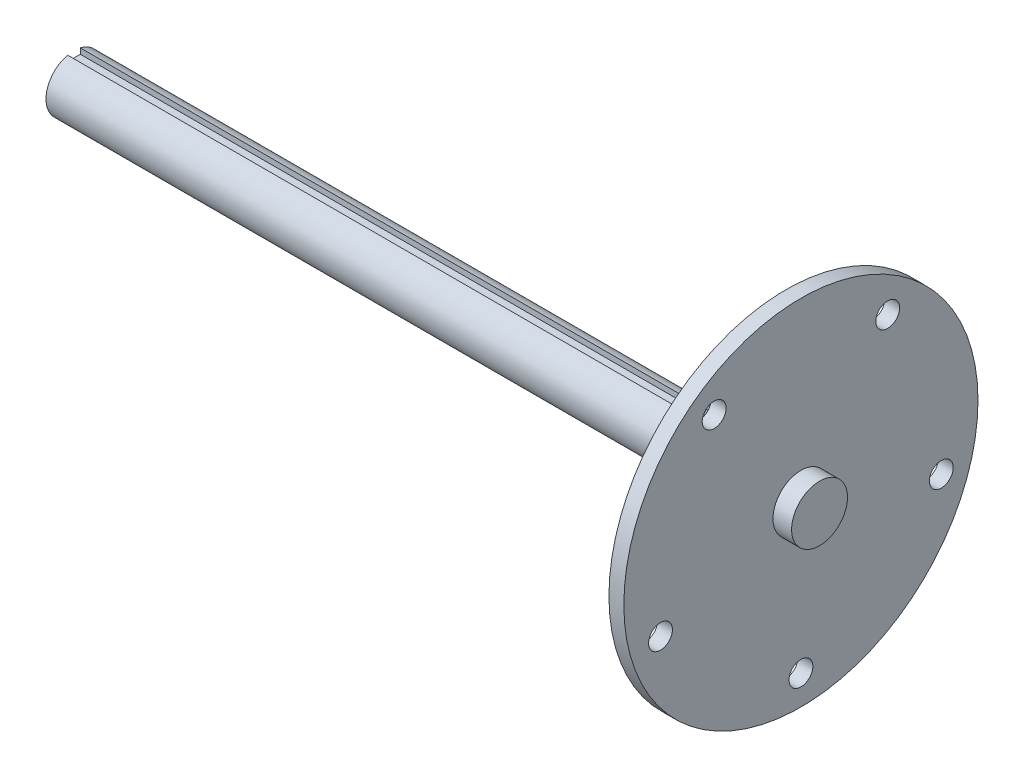
ISO-10303-21;
HEADER;
FILE_DESCRIPTION(('STEP AP214'),'2;1');
FILE_NAME('part.step','',(''),(''),'','','');
FILE_SCHEMA(('AUTOMOTIVE_DESIGN { 1 0 10303 214 1 1 1 1 }'));
ENDSEC;
DATA;
#1=APPLICATION_CONTEXT('core data for automotive mechanical design processes');
#2=APPLICATION_PROTOCOL_DEFINITION('international standard','automotive_design',2000,#1);
#3=PRODUCT_CONTEXT('',#1,'mechanical');
#4=PRODUCT('Part','Part','',(#3));
#5=PRODUCT_RELATED_PRODUCT_CATEGORY('part','',(#4));
#6=PRODUCT_DEFINITION_FORMATION('','',#4);
#7=PRODUCT_DEFINITION_CONTEXT('part definition',#1,'design');
#8=PRODUCT_DEFINITION('design','',#6,#7);
#9=PRODUCT_DEFINITION_SHAPE('','',#8);
#10=(LENGTH_UNIT() NAMED_UNIT(*) SI_UNIT(.MILLI.,.METRE.));
#11=(NAMED_UNIT(*) PLANE_ANGLE_UNIT() SI_UNIT($,.RADIAN.));
#12=(NAMED_UNIT(*) SI_UNIT($,.STERADIAN.) SOLID_ANGLE_UNIT());
#13=UNCERTAINTY_MEASURE_WITH_UNIT(LENGTH_MEASURE(1.E-05),#10,'distance_accuracy_value','');
#14=(GEOMETRIC_REPRESENTATION_CONTEXT(3) GLOBAL_UNCERTAINTY_ASSIGNED_CONTEXT((#13)) GLOBAL_UNIT_ASSIGNED_CONTEXT((#10,
#11,#12)) REPRESENTATION_CONTEXT('',''));
#15=CARTESIAN_POINT('',(0.,0.,0.));
#16=DIRECTION('',(0.,0.,1.));
#17=DIRECTION('',(1.,0.,0.));
#18=AXIS2_PLACEMENT_3D('',#15,#16,#17);
#19=CARTESIAN_POINT('',(5.08,0.,0.));
#20=DIRECTION('',(1.,0.,0.));
#21=DIRECTION('',(0.,0.,-1.));
#22=AXIS2_PLACEMENT_3D('',#19,#20,#21);
#23=PLANE('',#22);
#24=CARTESIAN_POINT('',(5.08,0.,0.));
#25=DIRECTION('',(1.,0.,0.));
#26=DIRECTION('',(0.,0.,-1.));
#27=AXIS2_PLACEMENT_3D('',#24,#25,#26);
#28=CIRCLE('',#27,9.525);
#29=CARTESIAN_POINT('',(5.08,0.,-9.525));
#30=VERTEX_POINT('',#29);
#31=EDGE_CURVE('E111',#30,#30,#28,.T.);
#32=ORIENTED_EDGE('',*,*,#31,.F.);
#33=EDGE_LOOP('',(#32));
#34=FACE_BOUND('',#33,.T.);
#35=CARTESIAN_POINT('',(5.08,40.687082681105,-29.5608959082932));
#36=DIRECTION('',(1.,0.,0.));
#37=DIRECTION('',(0.,0.,-1.));
#38=AXIS2_PLACEMENT_3D('',#35,#36,#37);
#39=CIRCLE('',#38,4.06400000000001);
#40=CARTESIAN_POINT('',(5.08,40.687082681105,-33.6248959082932));
#41=VERTEX_POINT('',#40);
#42=EDGE_CURVE('E123',#41,#41,#39,.T.);
#43=ORIENTED_EDGE('',*,*,#42,.F.);
#44=EDGE_LOOP('',(#43));
#45=FACE_BOUND('',#44,.T.);
#46=CARTESIAN_POINT('',(5.08,-15.5410826811047,47.8305343175159));
#47=DIRECTION('',(1.,0.,0.));
#48=DIRECTION('',(0.,0.,-1.));
#49=AXIS2_PLACEMENT_3D('',#46,#47,#48);
#50=CIRCLE('',#49,4.064);
#51=CARTESIAN_POINT('',(5.08,-15.5410826811047,43.7665343175159));
#52=VERTEX_POINT('',#51);
#53=EDGE_CURVE('E135',#52,#52,#50,.T.);
#54=ORIENTED_EDGE('',*,*,#53,.F.);
#55=EDGE_LOOP('',(#54));
#56=FACE_BOUND('',#55,.T.);
#57=CARTESIAN_POINT('',(5.08,0.,0.));
#58=DIRECTION('',(1.,0.,0.));
#59=DIRECTION('',(0.,0.,-1.));
#60=AXIS2_PLACEMENT_3D('',#57,#58,#59);
#61=CIRCLE('',#60,60.325);
#62=CARTESIAN_POINT('',(5.08,0.,-60.325));
#63=VERTEX_POINT('',#62);
#64=EDGE_CURVE('E115',#63,#63,#61,.T.);
#65=ORIENTED_EDGE('',*,*,#64,.T.);
#66=EDGE_LOOP('',(#65));
#67=FACE_BOUND('',#66,.T.);
#68=CARTESIAN_POINT('',(5.08,-50.292,0.));
#69=DIRECTION('',(1.,0.,0.));
#70=DIRECTION('',(0.,0.,-1.));
#71=AXIS2_PLACEMENT_3D('',#68,#69,#70);
#72=CIRCLE('',#71,4.064);
#73=CARTESIAN_POINT('',(5.08,-50.292,-4.06400000000001));
#74=VERTEX_POINT('',#73);
#75=EDGE_CURVE('E141',#74,#74,#72,.T.);
#76=ORIENTED_EDGE('',*,*,#75,.F.);
#77=EDGE_LOOP('',(#76));
#78=FACE_BOUND('',#77,.T.);
#79=CARTESIAN_POINT('',(5.08,40.6870826811051,29.560895908293));
#80=DIRECTION('',(1.,0.,0.));
#81=DIRECTION('',(0.,0.,-1.));
#82=AXIS2_PLACEMENT_3D('',#79,#80,#81);
#83=CIRCLE('',#82,4.064);
#84=CARTESIAN_POINT('',(5.08,40.6870826811051,25.496895908293));
#85=VERTEX_POINT('',#84);
#86=EDGE_CURVE('E129',#85,#85,#83,.T.);
#87=ORIENTED_EDGE('',*,*,#86,.F.);
#88=EDGE_LOOP('',(#87));
#89=FACE_BOUND('',#88,.T.);
#90=CARTESIAN_POINT('',(5.08,-15.5410826811048,-47.830534317516));
#91=DIRECTION('',(1.,0.,0.));
#92=DIRECTION('',(0.,0.,-1.));
#93=AXIS2_PLACEMENT_3D('',#90,#91,#92);
#94=CIRCLE('',#93,4.064);
#95=CARTESIAN_POINT('',(5.08,-15.5410826811048,-51.894534317516));
#96=VERTEX_POINT('',#95);
#97=EDGE_CURVE('E116',#96,#96,#94,.T.);
#98=ORIENTED_EDGE('',*,*,#97,.F.);
#99=EDGE_LOOP('',(#98));
#100=FACE_BOUND('',#99,.T.);
#101=ADVANCED_FACE('F37',(#34,#45,#56,#67,#78,#89,#100),#23,.T.);
#102=CARTESIAN_POINT('',(0.,0.,0.));
#103=DIRECTION('',(1.,0.,0.));
#104=DIRECTION('',(0.,0.,-1.));
#105=AXIS2_PLACEMENT_3D('',#102,#103,#104);
#106=PLANE('',#105);
#107=CARTESIAN_POINT('',(0.,0.,0.));
#108=DIRECTION('',(1.,0.,0.));
#109=DIRECTION('',(0.,0.,-1.));
#110=AXIS2_PLACEMENT_3D('',#107,#108,#109);
#111=CIRCLE('',#110,9.525);
#112=CARTESIAN_POINT('',(0.,0.,-9.525));
#113=VERTEX_POINT('',#112);
#114=EDGE_CURVE('E110',#113,#113,#111,.T.);
#115=ORIENTED_EDGE('',*,*,#114,.T.);
#116=EDGE_LOOP('',(#115));
#117=FACE_BOUND('',#116,.T.);
#118=CARTESIAN_POINT('',(0.,40.687082681105,-29.5608959082932));
#119=DIRECTION('',(1.,0.,0.));
#120=DIRECTION('',(0.,0.,-1.));
#121=AXIS2_PLACEMENT_3D('',#118,#119,#120);
#122=CIRCLE('',#121,4.06400000000001);
#123=CARTESIAN_POINT('',(0.,40.687082681105,-33.6248959082932));
#124=VERTEX_POINT('',#123);
#125=EDGE_CURVE('E119',#124,#124,#122,.T.);
#126=ORIENTED_EDGE('',*,*,#125,.T.);
#127=EDGE_LOOP('',(#126));
#128=FACE_BOUND('',#127,.T.);
#129=CARTESIAN_POINT('',(0.,-15.5410826811047,47.8305343175159));
#130=DIRECTION('',(1.,0.,0.));
#131=DIRECTION('',(0.,0.,-1.));
#132=AXIS2_PLACEMENT_3D('',#129,#130,#131);
#133=CIRCLE('',#132,4.064);
#134=CARTESIAN_POINT('',(0.,-15.5410826811047,43.7665343175159));
#135=VERTEX_POINT('',#134);
#136=EDGE_CURVE('E132',#135,#135,#133,.T.);
#137=ORIENTED_EDGE('',*,*,#136,.T.);
#138=EDGE_LOOP('',(#137));
#139=FACE_BOUND('',#138,.T.);
#140=CARTESIAN_POINT('',(0.,0.,0.));
#141=DIRECTION('',(1.,0.,0.));
#142=DIRECTION('',(0.,0.,-1.));
#143=AXIS2_PLACEMENT_3D('',#140,#141,#142);
#144=CIRCLE('',#143,60.325);
#145=CARTESIAN_POINT('',(0.,0.,-60.325));
#146=VERTEX_POINT('',#145);
#147=EDGE_CURVE('E144',#146,#146,#144,.T.);
#148=ORIENTED_EDGE('',*,*,#147,.F.);
#149=EDGE_LOOP('',(#148));
#150=FACE_BOUND('',#149,.T.);
#151=CARTESIAN_POINT('',(0.,-50.292,0.));
#152=DIRECTION('',(1.,0.,0.));
#153=DIRECTION('',(0.,0.,-1.));
#154=AXIS2_PLACEMENT_3D('',#151,#152,#153);
#155=CIRCLE('',#154,4.064);
#156=CARTESIAN_POINT('',(0.,-50.292,-4.06400000000001));
#157=VERTEX_POINT('',#156);
#158=EDGE_CURVE('E138',#157,#157,#155,.T.);
#159=ORIENTED_EDGE('',*,*,#158,.T.);
#160=EDGE_LOOP('',(#159));
#161=FACE_BOUND('',#160,.T.);
#162=CARTESIAN_POINT('',(0.,40.6870826811051,29.560895908293));
#163=DIRECTION('',(1.,0.,0.));
#164=DIRECTION('',(0.,0.,-1.));
#165=AXIS2_PLACEMENT_3D('',#162,#163,#164);
#166=CIRCLE('',#165,4.064);
#167=CARTESIAN_POINT('',(0.,40.6870826811051,25.496895908293));
#168=VERTEX_POINT('',#167);
#169=EDGE_CURVE('E126',#168,#168,#166,.T.);
#170=ORIENTED_EDGE('',*,*,#169,.T.);
#171=EDGE_LOOP('',(#170));
#172=FACE_BOUND('',#171,.T.);
#173=CARTESIAN_POINT('',(0.,-15.5410826811048,-47.830534317516));
#174=DIRECTION('',(1.,0.,0.));
#175=DIRECTION('',(0.,0.,-1.));
#176=AXIS2_PLACEMENT_3D('',#173,#174,#175);
#177=CIRCLE('',#176,4.064);
#178=CARTESIAN_POINT('',(0.,-15.5410826811048,-51.894534317516));
#179=VERTEX_POINT('',#178);
#180=EDGE_CURVE('E120',#179,#179,#177,.T.);
#181=ORIENTED_EDGE('',*,*,#180,.T.);
#182=EDGE_LOOP('',(#181));
#183=FACE_BOUND('',#182,.T.);
#184=ADVANCED_FACE('F165',(#117,#128,#139,#150,#161,#172,#183),#106,.F.);
#185=CARTESIAN_POINT('',(5.08,0.,0.));
#186=DIRECTION('',(-1.,0.,0.));
#187=DIRECTION('',(0.,0.,1.));
#188=AXIS2_PLACEMENT_3D('',#185,#186,#187);
#189=CYLINDRICAL_SURFACE('',#188,60.325);
#190=ORIENTED_EDGE('',*,*,#64,.F.);
#191=EDGE_LOOP('',(#190));
#192=FACE_BOUND('',#191,.T.);
#193=ORIENTED_EDGE('',*,*,#147,.T.);
#194=EDGE_LOOP('',(#193));
#195=FACE_BOUND('',#194,.T.);
#196=ADVANCED_FACE('F39',(#192,#195),#189,.T.);
#197=CARTESIAN_POINT('',(5.08,-50.292,0.));
#198=DIRECTION('',(-1.,0.,0.));
#199=DIRECTION('',(0.,0.,1.));
#200=AXIS2_PLACEMENT_3D('',#197,#198,#199);
#201=CYLINDRICAL_SURFACE('',#200,4.064);
#202=ORIENTED_EDGE('',*,*,#75,.T.);
#203=EDGE_LOOP('',(#202));
#204=FACE_BOUND('',#203,.T.);
#205=ORIENTED_EDGE('',*,*,#158,.F.);
#206=EDGE_LOOP('',(#205));
#207=FACE_BOUND('',#206,.T.);
#208=ADVANCED_FACE('F201',(#204,#207),#201,.F.);
#209=CARTESIAN_POINT('',(5.08,-15.5410826811047,47.8305343175159));
#210=DIRECTION('',(-1.,0.,0.));
#211=DIRECTION('',(0.,0.,1.));
#212=AXIS2_PLACEMENT_3D('',#209,#210,#211);
#213=CYLINDRICAL_SURFACE('',#212,4.064);
#214=ORIENTED_EDGE('',*,*,#53,.T.);
#215=EDGE_LOOP('',(#214));
#216=FACE_BOUND('',#215,.T.);
#217=ORIENTED_EDGE('',*,*,#136,.F.);
#218=EDGE_LOOP('',(#217));
#219=FACE_BOUND('',#218,.T.);
#220=ADVANCED_FACE('F204',(#216,#219),#213,.F.);
#221=CARTESIAN_POINT('',(5.08,40.6870826811051,29.560895908293));
#222=DIRECTION('',(-1.,0.,0.));
#223=DIRECTION('',(0.,0.,1.));
#224=AXIS2_PLACEMENT_3D('',#221,#222,#223);
#225=CYLINDRICAL_SURFACE('',#224,4.064);
#226=ORIENTED_EDGE('',*,*,#86,.T.);
#227=EDGE_LOOP('',(#226));
#228=FACE_BOUND('',#227,.T.);
#229=ORIENTED_EDGE('',*,*,#169,.F.);
#230=EDGE_LOOP('',(#229));
#231=FACE_BOUND('',#230,.T.);
#232=ADVANCED_FACE('F190',(#228,#231),#225,.F.);
#233=CARTESIAN_POINT('',(5.08,40.687082681105,-29.5608959082932));
#234=DIRECTION('',(-1.,0.,0.));
#235=DIRECTION('',(0.,0.,1.));
#236=AXIS2_PLACEMENT_3D('',#233,#234,#235);
#237=CYLINDRICAL_SURFACE('',#236,4.06400000000001);
#238=ORIENTED_EDGE('',*,*,#42,.T.);
#239=EDGE_LOOP('',(#238));
#240=FACE_BOUND('',#239,.T.);
#241=ORIENTED_EDGE('',*,*,#125,.F.);
#242=EDGE_LOOP('',(#241));
#243=FACE_BOUND('',#242,.T.);
#244=ADVANCED_FACE('F182',(#240,#243),#237,.F.);
#245=CARTESIAN_POINT('',(5.08,-15.5410826811048,-47.830534317516));
#246=DIRECTION('',(-1.,0.,0.));
#247=DIRECTION('',(0.,0.,1.));
#248=AXIS2_PLACEMENT_3D('',#245,#246,#247);
#249=CYLINDRICAL_SURFACE('',#248,4.064);
#250=ORIENTED_EDGE('',*,*,#97,.T.);
#251=EDGE_LOOP('',(#250));
#252=FACE_BOUND('',#251,.T.);
#253=ORIENTED_EDGE('',*,*,#180,.F.);
#254=EDGE_LOOP('',(#253));
#255=FACE_BOUND('',#254,.T.);
#256=ADVANCED_FACE('F180',(#252,#255),#249,.F.);
#257=CARTESIAN_POINT('',(-242.57,0.,0.));
#258=DIRECTION('',(1.,0.,0.));
#259=DIRECTION('',(0.,0.,-1.));
#260=AXIS2_PLACEMENT_3D('',#257,#258,#259);
#261=PLANE('',#260);
#262=DIRECTION('',(0.,0.,1.));
#263=VECTOR('',#262,1.);
#264=CARTESIAN_POINT('',(-242.57,7.375,2.159));
#265=LINE('',#264,#263);
#266=CARTESIAN_POINT('',(-242.57,7.375,-2.159));
#267=VERTEX_POINT('',#266);
#268=CARTESIAN_POINT('',(-242.57,7.375,2.159));
#269=VERTEX_POINT('',#268);
#270=EDGE_CURVE('E87',#267,#269,#265,.T.);
#271=ORIENTED_EDGE('',*,*,#270,.F.);
#272=DIRECTION('',(0.,-1.,0.));
#273=VECTOR('',#272,1.);
#274=CARTESIAN_POINT('',(-242.57,7.375,-2.159));
#275=LINE('',#274,#273);
#276=CARTESIAN_POINT('',(-242.57,9.27708704281683,-2.159));
#277=VERTEX_POINT('',#276);
#278=EDGE_CURVE('E93',#277,#267,#275,.T.);
#279=ORIENTED_EDGE('',*,*,#278,.F.);
#280=CARTESIAN_POINT('',(-242.57,0.,0.));
#281=DIRECTION('',(1.,0.,0.));
#282=DIRECTION('',(0.,0.,-1.));
#283=AXIS2_PLACEMENT_3D('',#280,#281,#282);
#284=CIRCLE('',#283,9.525);
#285=CARTESIAN_POINT('',(-242.57,9.27708704281683,2.159));
#286=VERTEX_POINT('',#285);
#287=EDGE_CURVE('E98',#286,#277,#284,.T.);
#288=ORIENTED_EDGE('',*,*,#287,.F.);
#289=DIRECTION('',(0.,1.,0.));
#290=VECTOR('',#289,1.);
#291=CARTESIAN_POINT('',(-242.57,7.375,2.159));
#292=LINE('',#291,#290);
#293=EDGE_CURVE('E52',#269,#286,#292,.T.);
#294=ORIENTED_EDGE('',*,*,#293,.F.);
#295=EDGE_LOOP('',(#271,#279,#288,#294));
#296=FACE_BOUND('',#295,.T.);
#297=ADVANCED_FACE('F96',(#296),#261,.F.);
#298=CARTESIAN_POINT('',(-242.57,0.,0.));
#299=DIRECTION('',(1.,0.,0.));
#300=DIRECTION('',(0.,0.,-1.));
#301=AXIS2_PLACEMENT_3D('',#298,#299,#300);
#302=CYLINDRICAL_SURFACE('',#301,9.525);
#303=DIRECTION('',(1.,0.,0.));
#304=VECTOR('',#303,1.);
#305=CARTESIAN_POINT('',(-242.57,9.27708704281683,-2.159));
#306=LINE('',#305,#304);
#307=CARTESIAN_POINT('',(-13.97,9.27708704281683,-2.159));
#308=VERTEX_POINT('',#307);
#309=EDGE_CURVE('E12',#308,#277,#306,.F.);
#310=ORIENTED_EDGE('',*,*,#309,.F.);
#311=CARTESIAN_POINT('',(-13.97,0.,0.));
#312=DIRECTION('',(1.,0.,0.));
#313=DIRECTION('',(0.,0.,-1.));
#314=AXIS2_PLACEMENT_3D('',#311,#312,#313);
#315=CIRCLE('',#314,9.525);
#316=CARTESIAN_POINT('',(-13.97,9.27708704281683,2.159));
#317=VERTEX_POINT('',#316);
#318=EDGE_CURVE('E45',#317,#308,#315,.F.);
#319=ORIENTED_EDGE('',*,*,#318,.F.);
#320=DIRECTION('',(1.,0.,0.));
#321=VECTOR('',#320,1.);
#322=CARTESIAN_POINT('',(-242.57,9.27708704281683,2.159));
#323=LINE('',#322,#321);
#324=EDGE_CURVE('E114',#286,#317,#323,.T.);
#325=ORIENTED_EDGE('',*,*,#324,.F.);
#326=ORIENTED_EDGE('',*,*,#287,.T.);
#327=EDGE_LOOP('',(#310,#319,#325,#326));
#328=FACE_BOUND('',#327,.T.);
#329=ORIENTED_EDGE('',*,*,#114,.F.);
#330=EDGE_LOOP('',(#329));
#331=FACE_BOUND('',#330,.T.);
#332=ADVANCED_FACE('F158',(#328,#331),#302,.T.);
#333=ORIENTED_EDGE('',*,*,#31,.T.);
#334=EDGE_LOOP('',(#333));
#335=FACE_BOUND('',#334,.T.);
#336=CARTESIAN_POINT('',(11.43,0.,0.));
#337=DIRECTION('',(1.,0.,0.));
#338=DIRECTION('',(0.,0.,-1.));
#339=AXIS2_PLACEMENT_3D('',#336,#337,#338);
#340=CIRCLE('',#339,9.525);
#341=CARTESIAN_POINT('',(11.43,0.,-9.525));
#342=VERTEX_POINT('',#341);
#343=EDGE_CURVE('E103',#342,#342,#340,.T.);
#344=ORIENTED_EDGE('',*,*,#343,.F.);
#345=EDGE_LOOP('',(#344));
#346=FACE_BOUND('',#345,.T.);
#347=ADVANCED_FACE('F161',(#335,#346),#302,.T.);
#348=CARTESIAN_POINT('',(11.43,0.,0.));
#349=DIRECTION('',(1.,0.,0.));
#350=DIRECTION('',(0.,0.,-1.));
#351=AXIS2_PLACEMENT_3D('',#348,#349,#350);
#352=PLANE('',#351);
#353=ORIENTED_EDGE('',*,*,#343,.T.);
#354=EDGE_LOOP('',(#353));
#355=FACE_BOUND('',#354,.T.);
#356=ADVANCED_FACE('F250',(#355),#352,.T.);
#357=CARTESIAN_POINT('',(-13.97,0.,0.));
#358=DIRECTION('',(1.,0.,0.));
#359=DIRECTION('',(0.,0.,-1.));
#360=AXIS2_PLACEMENT_3D('',#357,#358,#359);
#361=PLANE('',#360);
#362=ORIENTED_EDGE('',*,*,#318,.T.);
#363=DIRECTION('',(0.,-1.,0.));
#364=VECTOR('',#363,1.);
#365=CARTESIAN_POINT('',(-13.97,7.375,-2.159));
#366=LINE('',#365,#364);
#367=CARTESIAN_POINT('',(-13.97,7.375,-2.159));
#368=VERTEX_POINT('',#367);
#369=EDGE_CURVE('E92',#308,#368,#366,.T.);
#370=ORIENTED_EDGE('',*,*,#369,.T.);
#371=DIRECTION('',(0.,0.,1.));
#372=VECTOR('',#371,1.);
#373=CARTESIAN_POINT('',(-13.97,7.375,2.159));
#374=LINE('',#373,#372);
#375=CARTESIAN_POINT('',(-13.97,7.375,2.159));
#376=VERTEX_POINT('',#375);
#377=EDGE_CURVE('E83',#368,#376,#374,.T.);
#378=ORIENTED_EDGE('',*,*,#377,.T.);
#379=DIRECTION('',(0.,1.,0.));
#380=VECTOR('',#379,1.);
#381=CARTESIAN_POINT('',(-13.97,7.375,2.159));
#382=LINE('',#381,#380);
#383=EDGE_CURVE('E79',#376,#317,#382,.T.);
#384=ORIENTED_EDGE('',*,*,#383,.T.);
#385=EDGE_LOOP('',(#362,#370,#378,#384));
#386=FACE_BOUND('',#385,.T.);
#387=ADVANCED_FACE('F155',(#386),#361,.F.);
#388=CARTESIAN_POINT('',(16.2536525579689,7.375,-2.159));
#389=DIRECTION('',(0.,0.,-1.));
#390=DIRECTION('',(0.,1.,0.));
#391=AXIS2_PLACEMENT_3D('',#388,#389,#390);
#392=PLANE('',#391);
#393=ORIENTED_EDGE('',*,*,#309,.T.);
#394=ORIENTED_EDGE('',*,*,#278,.T.);
#395=DIRECTION('',(-1.,0.,0.));
#396=VECTOR('',#395,1.);
#397=CARTESIAN_POINT('',(16.2536525579689,7.375,-2.159));
#398=LINE('',#397,#396);
#399=EDGE_CURVE('E90',#368,#267,#398,.T.);
#400=ORIENTED_EDGE('',*,*,#399,.F.);
#401=ORIENTED_EDGE('',*,*,#369,.F.);
#402=EDGE_LOOP('',(#393,#394,#400,#401));
#403=FACE_BOUND('',#402,.T.);
#404=ADVANCED_FACE('F157',(#403),#392,.F.);
#405=CARTESIAN_POINT('',(16.2536525579689,7.375,2.159));
#406=DIRECTION('',(0.,-1.,0.));
#407=DIRECTION('',(0.,0.,-1.));
#408=AXIS2_PLACEMENT_3D('',#405,#406,#407);
#409=PLANE('',#408);
#410=ORIENTED_EDGE('',*,*,#399,.T.);
#411=ORIENTED_EDGE('',*,*,#270,.T.);
#412=DIRECTION('',(-1.,0.,0.));
#413=VECTOR('',#412,1.);
#414=CARTESIAN_POINT('',(16.2536525579689,7.375,2.159));
#415=LINE('',#414,#413);
#416=EDGE_CURVE('E75',#376,#269,#415,.T.);
#417=ORIENTED_EDGE('',*,*,#416,.F.);
#418=ORIENTED_EDGE('',*,*,#377,.F.);
#419=EDGE_LOOP('',(#410,#411,#417,#418));
#420=FACE_BOUND('',#419,.T.);
#421=ADVANCED_FACE('F88',(#420),#409,.F.);
#422=CARTESIAN_POINT('',(16.2536525579689,7.375,2.159));
#423=DIRECTION('',(0.,0.,1.));
#424=DIRECTION('',(0.,-1.,0.));
#425=AXIS2_PLACEMENT_3D('',#422,#423,#424);
#426=PLANE('',#425);
#427=ORIENTED_EDGE('',*,*,#324,.T.);
#428=ORIENTED_EDGE('',*,*,#383,.F.);
#429=ORIENTED_EDGE('',*,*,#416,.T.);
#430=ORIENTED_EDGE('',*,*,#293,.T.);
#431=EDGE_LOOP('',(#427,#428,#429,#430));
#432=FACE_BOUND('',#431,.T.);
#433=ADVANCED_FACE('F77',(#432),#426,.F.);
#434=CLOSED_SHELL('',(#101,#184,#196,#208,#220,#232,#244,#256,#297,#332,#347,#356,#387,#404,
#421,#433));
#435=MANIFOLD_SOLID_BREP('B2',#434);
#436=ADVANCED_BREP_SHAPE_REPRESENTATION('',(#18,#435),#14);
#437=SHAPE_DEFINITION_REPRESENTATION(#9,#436);
ENDSEC;
END-ISO-10303-21;
